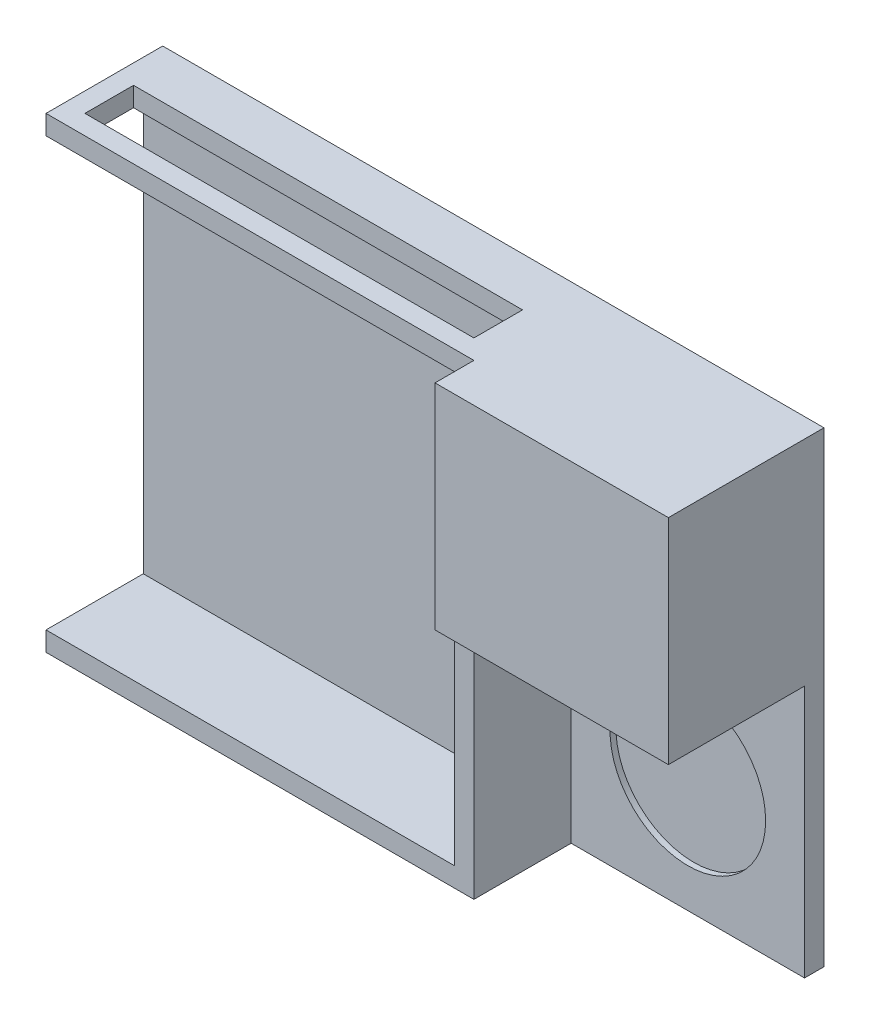
ISO-10303-21;
HEADER;
FILE_DESCRIPTION(('STEP AP214'),'2;1');
FILE_NAME('part.step','',(''),(''),'','','');
FILE_SCHEMA(('AUTOMOTIVE_DESIGN { 1 0 10303 214 1 1 1 1 }'));
ENDSEC;
DATA;
#1=APPLICATION_CONTEXT('core data for automotive mechanical design processes');
#2=APPLICATION_PROTOCOL_DEFINITION('international standard','automotive_design',2000,#1);
#3=PRODUCT_CONTEXT('',#1,'mechanical');
#4=PRODUCT('Part','Part','',(#3));
#5=PRODUCT_RELATED_PRODUCT_CATEGORY('part','',(#4));
#6=PRODUCT_DEFINITION_FORMATION('','',#4);
#7=PRODUCT_DEFINITION_CONTEXT('part definition',#1,'design');
#8=PRODUCT_DEFINITION('design','',#6,#7);
#9=PRODUCT_DEFINITION_SHAPE('','',#8);
#10=(LENGTH_UNIT() NAMED_UNIT(*) SI_UNIT(.MILLI.,.METRE.));
#11=(NAMED_UNIT(*) PLANE_ANGLE_UNIT() SI_UNIT($,.RADIAN.));
#12=(NAMED_UNIT(*) SI_UNIT($,.STERADIAN.) SOLID_ANGLE_UNIT());
#13=UNCERTAINTY_MEASURE_WITH_UNIT(LENGTH_MEASURE(1.E-05),#10,'distance_accuracy_value','');
#14=(GEOMETRIC_REPRESENTATION_CONTEXT(3) GLOBAL_UNCERTAINTY_ASSIGNED_CONTEXT((#13)) GLOBAL_UNIT_ASSIGNED_CONTEXT((#10,
#11,#12)) REPRESENTATION_CONTEXT('',''));
#15=CARTESIAN_POINT('',(0.,0.,0.));
#16=DIRECTION('',(0.,0.,1.));
#17=DIRECTION('',(1.,0.,0.));
#18=AXIS2_PLACEMENT_3D('',#15,#16,#17);
#19=CARTESIAN_POINT('',(-49.2177037871919,15.0239424703891,60.));
#20=DIRECTION('',(0.,-1.,0.));
#21=DIRECTION('',(1.,0.,0.));
#22=AXIS2_PLACEMENT_3D('',#19,#20,#21);
#23=PLANE('',#22);
#24=DIRECTION('',(0.,0.,1.));
#25=VECTOR('',#24,1.);
#26=CARTESIAN_POINT('',(-119.217703787192,15.0239424703891,60.));
#27=LINE('',#26,#25);
#28=CARTESIAN_POINT('',(-119.217703787192,15.0239424703891,52.5));
#29=VERTEX_POINT('',#28);
#30=CARTESIAN_POINT('',(-119.217703787192,15.0239424703891,57.5));
#31=VERTEX_POINT('',#30);
#32=EDGE_CURVE('E12',#29,#31,#27,.T.);
#33=ORIENTED_EDGE('',*,*,#32,.F.);
#34=DIRECTION('',(-1.,0.,0.));
#35=VECTOR('',#34,1.);
#36=CARTESIAN_POINT('',(-49.2177037871919,15.0239424703891,52.5));
#37=LINE('',#36,#35);
#38=CARTESIAN_POINT('',(-269.217703787192,15.0239424703891,52.5));
#39=VERTEX_POINT('',#38);
#40=EDGE_CURVE('E275',#29,#39,#37,.T.);
#41=ORIENTED_EDGE('',*,*,#40,.T.);
#42=DIRECTION('',(0.,0.,-1.));
#43=VECTOR('',#42,1.);
#44=CARTESIAN_POINT('',(-269.217703787192,15.0239424703891,60.));
#45=LINE('',#44,#43);
#46=CARTESIAN_POINT('',(-269.217703787192,15.0239424703891,10.));
#47=VERTEX_POINT('',#46);
#48=EDGE_CURVE('E350',#39,#47,#45,.T.);
#49=ORIENTED_EDGE('',*,*,#48,.T.);
#50=DIRECTION('',(-1.,0.,0.));
#51=VECTOR('',#50,1.);
#52=CARTESIAN_POINT('',(-49.2177037871919,15.0239424703891,10.));
#53=LINE('',#52,#51);
#54=CARTESIAN_POINT('',(-59.2177037871919,15.0239424703891,10.));
#55=VERTEX_POINT('',#54);
#56=EDGE_CURVE('E473',#55,#47,#53,.T.);
#57=ORIENTED_EDGE('',*,*,#56,.F.);
#58=DIRECTION('',(0.,0.,-1.));
#59=VECTOR('',#58,1.);
#60=CARTESIAN_POINT('',(-59.2177037871919,15.0239424703891,60.));
#61=LINE('',#60,#59);
#62=CARTESIAN_POINT('',(-59.2177037871918,15.0239424703891,25.));
#63=VERTEX_POINT('',#62);
#64=EDGE_CURVE('E349',#63,#55,#61,.T.);
#65=ORIENTED_EDGE('',*,*,#64,.F.);
#66=DIRECTION('',(-1.,0.,0.));
#67=VECTOR('',#66,1.);
#68=CARTESIAN_POINT('',(-49.2177037871919,15.0239424703891,25.));
#69=LINE('',#68,#67);
#70=CARTESIAN_POINT('',(-259.217703787192,15.0239424703891,25.));
#71=VERTEX_POINT('',#70);
#72=EDGE_CURVE('E298',#63,#71,#69,.T.);
#73=ORIENTED_EDGE('',*,*,#72,.T.);
#74=DIRECTION('',(0.,0.,-1.));
#75=VECTOR('',#74,1.);
#76=CARTESIAN_POINT('',(-259.217703787192,15.0239424703891,60.0000000000005));
#77=LINE('',#76,#75);
#78=CARTESIAN_POINT('',(-259.217703787192,15.0239424703891,50.));
#79=VERTEX_POINT('',#78);
#80=EDGE_CURVE('E359',#79,#71,#77,.T.);
#81=ORIENTED_EDGE('',*,*,#80,.F.);
#82=DIRECTION('',(-1.,0.,0.));
#83=VECTOR('',#82,1.);
#84=CARTESIAN_POINT('',(-49.2177037871919,15.0239424703891,50.));
#85=LINE('',#84,#83);
#86=CARTESIAN_POINT('',(-59.2177037871919,15.0239424703891,50.));
#87=VERTEX_POINT('',#86);
#88=EDGE_CURVE('E291',#87,#79,#85,.T.);
#89=ORIENTED_EDGE('',*,*,#88,.F.);
#90=CARTESIAN_POINT('',(-59.2177037871919,15.0239424703891,60.));
#91=VERTEX_POINT('',#90);
#92=EDGE_CURVE('E330',#91,#87,#61,.T.);
#93=ORIENTED_EDGE('',*,*,#92,.F.);
#94=DIRECTION('',(-1.,0.,0.));
#95=VECTOR('',#94,1.);
#96=CARTESIAN_POINT('',(-49.2177037871919,15.0239424703891,60.));
#97=LINE('',#96,#95);
#98=CARTESIAN_POINT('',(-269.217703787192,15.0239424703891,60.));
#99=VERTEX_POINT('',#98);
#100=EDGE_CURVE('E479',#91,#99,#97,.T.);
#101=ORIENTED_EDGE('',*,*,#100,.T.);
#102=CARTESIAN_POINT('',(-269.217703787192,15.0239424703891,57.5));
#103=VERTEX_POINT('',#102);
#104=EDGE_CURVE('E346',#99,#103,#45,.T.);
#105=ORIENTED_EDGE('',*,*,#104,.T.);
#106=DIRECTION('',(-1.,0.,0.));
#107=VECTOR('',#106,1.);
#108=CARTESIAN_POINT('',(-49.2177037871919,15.0239424703891,57.5));
#109=LINE('',#108,#107);
#110=EDGE_CURVE('E273',#31,#103,#109,.T.);
#111=ORIENTED_EDGE('',*,*,#110,.F.);
#112=EDGE_LOOP('',(#33,#41,#49,#57,#65,#73,#81,#89,#93,#101,#105,#111));
#113=FACE_BOUND('',#112,.T.);
#114=ADVANCED_FACE('F83',(#113),#23,.T.);
#115=CARTESIAN_POINT('',(-269.217703787192,0.,10.));
#116=DIRECTION('',(-1.,0.,0.));
#117=DIRECTION('',(0.,0.,1.));
#118=AXIS2_PLACEMENT_3D('',#115,#116,#117);
#119=PLANE('',#118);
#120=ORIENTED_EDGE('',*,*,#48,.F.);
#121=DIRECTION('',(0.,1.,0.));
#122=VECTOR('',#121,1.);
#123=CARTESIAN_POINT('',(-269.217703787192,0.,52.5));
#124=LINE('',#123,#122);
#125=CARTESIAN_POINT('',(-269.217703787192,16.2739424703891,52.5));
#126=VERTEX_POINT('',#125);
#127=EDGE_CURVE('E91',#39,#126,#124,.T.);
#128=ORIENTED_EDGE('',*,*,#127,.T.);
#129=DIRECTION('',(0.,0.,-1.));
#130=VECTOR('',#129,1.);
#131=CARTESIAN_POINT('',(-269.217703787192,16.2739424703891,57.5));
#132=LINE('',#131,#130);
#133=CARTESIAN_POINT('',(-269.217703787192,16.2739424703891,57.5));
#134=VERTEX_POINT('',#133);
#135=EDGE_CURVE('E259',#134,#126,#132,.T.);
#136=ORIENTED_EDGE('',*,*,#135,.F.);
#137=DIRECTION('',(0.,1.,0.));
#138=VECTOR('',#137,1.);
#139=CARTESIAN_POINT('',(-269.217703787192,0.,57.5));
#140=LINE('',#139,#138);
#141=EDGE_CURVE('E360',#103,#134,#140,.T.);
#142=ORIENTED_EDGE('',*,*,#141,.F.);
#143=ORIENTED_EDGE('',*,*,#104,.F.);
#144=DIRECTION('',(0.,-1.,0.));
#145=VECTOR('',#144,1.);
#146=CARTESIAN_POINT('',(-269.217703787192,25.0239424703891,60.));
#147=LINE('',#146,#145);
#148=CARTESIAN_POINT('',(-269.217703787192,25.0239424703891,60.));
#149=VERTEX_POINT('',#148);
#150=EDGE_CURVE('E481',#149,#99,#147,.T.);
#151=ORIENTED_EDGE('',*,*,#150,.F.);
#152=DIRECTION('',(0.,0.,-1.));
#153=VECTOR('',#152,1.);
#154=CARTESIAN_POINT('',(-269.217703787192,25.0239424703891,10.));
#155=LINE('',#154,#153);
#156=CARTESIAN_POINT('',(-269.217703787192,25.0239424703891,0.));
#157=VERTEX_POINT('',#156);
#158=EDGE_CURVE('E457',#149,#157,#155,.T.);
#159=ORIENTED_EDGE('',*,*,#158,.T.);
#160=DIRECTION('',(0.,1.,0.));
#161=VECTOR('',#160,1.);
#162=CARTESIAN_POINT('',(-269.217703787192,0.,0.));
#163=LINE('',#162,#161);
#164=CARTESIAN_POINT('',(-269.217703787192,-214.976057529611,0.));
#165=VERTEX_POINT('',#164);
#166=EDGE_CURVE('E438',#165,#157,#163,.T.);
#167=ORIENTED_EDGE('',*,*,#166,.F.);
#168=DIRECTION('',(0.,0.,-1.));
#169=VECTOR('',#168,1.);
#170=CARTESIAN_POINT('',(-269.217703787192,-214.976057529611,10.));
#171=LINE('',#170,#169);
#172=CARTESIAN_POINT('',(-269.217703787192,-214.976057529611,60.));
#173=VERTEX_POINT('',#172);
#174=EDGE_CURVE('E435',#173,#165,#171,.T.);
#175=ORIENTED_EDGE('',*,*,#174,.F.);
#176=DIRECTION('',(0.,1.,0.));
#177=VECTOR('',#176,1.);
#178=CARTESIAN_POINT('',(-269.217703787192,-214.976057529611,60.));
#179=LINE('',#178,#177);
#180=CARTESIAN_POINT('',(-269.217703787192,-204.976057529611,60.));
#181=VERTEX_POINT('',#180);
#182=EDGE_CURVE('E313',#173,#181,#179,.T.);
#183=ORIENTED_EDGE('',*,*,#182,.T.);
#184=DIRECTION('',(0.,0.,-1.));
#185=VECTOR('',#184,1.);
#186=CARTESIAN_POINT('',(-269.217703787192,-204.976057529611,60.));
#187=LINE('',#186,#185);
#188=CARTESIAN_POINT('',(-269.217703787192,-204.976057529611,10.));
#189=VERTEX_POINT('',#188);
#190=EDGE_CURVE('E336',#181,#189,#187,.T.);
#191=ORIENTED_EDGE('',*,*,#190,.T.);
#192=DIRECTION('',(0.,-1.,0.));
#193=VECTOR('',#192,1.);
#194=CARTESIAN_POINT('',(-269.217703787192,0.,10.));
#195=LINE('',#194,#193);
#196=EDGE_CURVE('E460',#47,#189,#195,.T.);
#197=ORIENTED_EDGE('',*,*,#196,.F.);
#198=EDGE_LOOP('',(#120,#128,#136,#142,#143,#151,#159,#167,#175,#183,#191,#197));
#199=FACE_BOUND('',#198,.T.);
#200=ADVANCED_FACE('F365',(#199),#119,.T.);
#201=CARTESIAN_POINT('',(0.,0.,10.));
#202=DIRECTION('',(0.,0.,1.));
#203=DIRECTION('',(1.,0.,0.));
#204=AXIS2_PLACEMENT_3D('',#201,#202,#203);
#205=PLANE('',#204);
#206=DIRECTION('',(-1.,0.,0.));
#207=VECTOR('',#206,1.);
#208=CARTESIAN_POINT('',(-49.2177037871918,-204.976057529611,10.));
#209=LINE('',#208,#207);
#210=CARTESIAN_POINT('',(-59.2177037871918,-204.976057529611,10.));
#211=VERTEX_POINT('',#210);
#212=EDGE_CURVE('E329',#211,#189,#209,.T.);
#213=ORIENTED_EDGE('',*,*,#212,.F.);
#214=DIRECTION('',(0.,-1.,0.));
#215=VECTOR('',#214,1.);
#216=CARTESIAN_POINT('',(-59.2177037871919,15.0239424703891,10.));
#217=LINE('',#216,#215);
#218=EDGE_CURVE('E305',#55,#211,#217,.T.);
#219=ORIENTED_EDGE('',*,*,#218,.F.);
#220=ORIENTED_EDGE('',*,*,#56,.T.);
#221=ORIENTED_EDGE('',*,*,#196,.T.);
#222=EDGE_LOOP('',(#213,#219,#220,#221));
#223=FACE_BOUND('',#222,.T.);
#224=ADVANCED_FACE('F396',(#223),#205,.T.);
#225=CARTESIAN_POINT('',(-99.2177037871918,25.0239424703892,10.));
#226=DIRECTION('',(0.,-1.,0.));
#227=DIRECTION('',(1.,0.,0.));
#228=AXIS2_PLACEMENT_3D('',#225,#226,#227);
#229=PLANE('',#228);
#230=DIRECTION('',(1.,0.,0.));
#231=VECTOR('',#230,1.);
#232=CARTESIAN_POINT('',(-49.2177037871919,25.0239424703892,80.));
#233=LINE('',#232,#231);
#234=CARTESIAN_POINT('',(-49.2177037871919,25.0239424703892,80.));
#235=VERTEX_POINT('',#234);
#236=CARTESIAN_POINT('',(70.7822962128082,25.0239424703892,80.));
#237=VERTEX_POINT('',#236);
#238=EDGE_CURVE('E232',#235,#237,#233,.T.);
#239=ORIENTED_EDGE('',*,*,#238,.T.);
#240=DIRECTION('',(0.,0.,-1.));
#241=VECTOR('',#240,1.);
#242=CARTESIAN_POINT('',(70.7822962128082,25.0239424703892,10.));
#243=LINE('',#242,#241);
#244=CARTESIAN_POINT('',(70.7822962128082,25.0239424703892,0.));
#245=VERTEX_POINT('',#244);
#246=EDGE_CURVE('E445',#237,#245,#243,.T.);
#247=ORIENTED_EDGE('',*,*,#246,.T.);
#248=DIRECTION('',(-1.,0.,0.));
#249=VECTOR('',#248,1.);
#250=CARTESIAN_POINT('',(-99.2177037871918,25.0239424703892,0.));
#251=LINE('',#250,#249);
#252=EDGE_CURVE('E448',#245,#157,#251,.T.);
#253=ORIENTED_EDGE('',*,*,#252,.T.);
#254=ORIENTED_EDGE('',*,*,#158,.F.);
#255=DIRECTION('',(-1.,0.,0.));
#256=VECTOR('',#255,1.);
#257=CARTESIAN_POINT('',(-49.2177037871919,25.0239424703891,60.));
#258=LINE('',#257,#256);
#259=CARTESIAN_POINT('',(-49.2177037871919,25.0239424703891,60.));
#260=VERTEX_POINT('',#259);
#261=EDGE_CURVE('E358',#260,#149,#258,.T.);
#262=ORIENTED_EDGE('',*,*,#261,.F.);
#263=DIRECTION('',(0.,0.,-1.));
#264=VECTOR('',#263,1.);
#265=CARTESIAN_POINT('',(-49.2177037871919,25.0239424703892,80.));
#266=LINE('',#265,#264);
#267=EDGE_CURVE('E243',#235,#260,#266,.T.);
#268=ORIENTED_EDGE('',*,*,#267,.F.);
#269=EDGE_LOOP('',(#239,#247,#253,#254,#262,#268));
#270=FACE_BOUND('',#269,.T.);
#271=DIRECTION('',(1.,0.,0.));
#272=VECTOR('',#271,1.);
#273=CARTESIAN_POINT('',(-259.217703787192,25.0239424703891,50.));
#274=LINE('',#273,#272);
#275=CARTESIAN_POINT('',(-259.217703787192,25.0239424703891,50.));
#276=VERTEX_POINT('',#275);
#277=CARTESIAN_POINT('',(-59.2177037871918,25.0239424703892,50.));
#278=VERTEX_POINT('',#277);
#279=EDGE_CURVE('E279',#276,#278,#274,.T.);
#280=ORIENTED_EDGE('',*,*,#279,.F.);
#281=DIRECTION('',(0.,0.,1.));
#282=VECTOR('',#281,1.);
#283=CARTESIAN_POINT('',(-259.217703787192,25.0239424703891,25.));
#284=LINE('',#283,#282);
#285=CARTESIAN_POINT('',(-259.217703787192,25.0239424703891,25.));
#286=VERTEX_POINT('',#285);
#287=EDGE_CURVE('E106',#286,#276,#284,.T.);
#288=ORIENTED_EDGE('',*,*,#287,.F.);
#289=DIRECTION('',(1.,0.,0.));
#290=VECTOR('',#289,1.);
#291=CARTESIAN_POINT('',(-259.217703787192,25.0239424703891,25.));
#292=LINE('',#291,#290);
#293=CARTESIAN_POINT('',(-59.2177037871918,25.0239424703892,25.));
#294=VERTEX_POINT('',#293);
#295=EDGE_CURVE('E285',#286,#294,#292,.T.);
#296=ORIENTED_EDGE('',*,*,#295,.T.);
#297=DIRECTION('',(0.,0.,1.));
#298=VECTOR('',#297,1.);
#299=CARTESIAN_POINT('',(-59.2177037871918,25.0239424703892,25.));
#300=LINE('',#299,#298);
#301=EDGE_CURVE('E282',#294,#278,#300,.T.);
#302=ORIENTED_EDGE('',*,*,#301,.T.);
#303=EDGE_LOOP('',(#280,#288,#296,#302));
#304=FACE_BOUND('',#303,.T.);
#305=ADVANCED_FACE('F417',(#270,#304),#229,.F.);
#306=CARTESIAN_POINT('',(-99.2177037871918,-214.976057529611,10.));
#307=DIRECTION('',(0.,-1.,0.));
#308=DIRECTION('',(1.,0.,0.));
#309=AXIS2_PLACEMENT_3D('',#306,#307,#308);
#310=PLANE('',#309);
#311=DIRECTION('',(-1.,0.,0.));
#312=VECTOR('',#311,1.);
#313=CARTESIAN_POINT('',(-99.2177037871918,-214.976057529611,0.));
#314=LINE('',#313,#312);
#315=CARTESIAN_POINT('',(70.7822962128082,-214.976057529611,0.));
#316=VERTEX_POINT('',#315);
#317=EDGE_CURVE('E431',#316,#165,#314,.T.);
#318=ORIENTED_EDGE('',*,*,#317,.F.);
#319=DIRECTION('',(0.,0.,-1.));
#320=VECTOR('',#319,1.);
#321=CARTESIAN_POINT('',(70.7822962128082,-214.976057529611,10.));
#322=LINE('',#321,#320);
#323=CARTESIAN_POINT('',(70.7822962128082,-214.976057529611,10.));
#324=VERTEX_POINT('',#323);
#325=EDGE_CURVE('E434',#324,#316,#322,.T.);
#326=ORIENTED_EDGE('',*,*,#325,.F.);
#327=DIRECTION('',(1.,0.,0.));
#328=VECTOR('',#327,1.);
#329=CARTESIAN_POINT('',(-99.2177037871918,-214.976057529611,10.));
#330=LINE('',#329,#328);
#331=CARTESIAN_POINT('',(-49.2177037871919,-214.976057529611,10.));
#332=VERTEX_POINT('',#331);
#333=EDGE_CURVE('E331',#332,#324,#330,.T.);
#334=ORIENTED_EDGE('',*,*,#333,.F.);
#335=DIRECTION('',(0.,0.,-1.));
#336=VECTOR('',#335,1.);
#337=CARTESIAN_POINT('',(-49.2177037871918,-214.976057529611,60.));
#338=LINE('',#337,#336);
#339=CARTESIAN_POINT('',(-49.2177037871918,-214.976057529611,60.));
#340=VERTEX_POINT('',#339);
#341=EDGE_CURVE('E319',#340,#332,#338,.T.);
#342=ORIENTED_EDGE('',*,*,#341,.F.);
#343=DIRECTION('',(-1.,0.,0.));
#344=VECTOR('',#343,1.);
#345=CARTESIAN_POINT('',(-49.2177037871918,-214.976057529611,60.));
#346=LINE('',#345,#344);
#347=EDGE_CURVE('E316',#340,#173,#346,.T.);
#348=ORIENTED_EDGE('',*,*,#347,.T.);
#349=ORIENTED_EDGE('',*,*,#174,.T.);
#350=EDGE_LOOP('',(#318,#326,#334,#342,#348,#349));
#351=FACE_BOUND('',#350,.T.);
#352=ADVANCED_FACE('F418',(#351),#310,.T.);
#353=CARTESIAN_POINT('',(70.7822962128082,0.,10.));
#354=DIRECTION('',(1.,0.,0.));
#355=DIRECTION('',(0.,1.,0.));
#356=AXIS2_PLACEMENT_3D('',#353,#354,#355);
#357=PLANE('',#356);
#358=DIRECTION('',(0.,-1.,0.));
#359=VECTOR('',#358,1.);
#360=CARTESIAN_POINT('',(70.7822962128082,0.,0.));
#361=LINE('',#360,#359);
#362=EDGE_CURVE('E439',#245,#316,#361,.T.);
#363=ORIENTED_EDGE('',*,*,#362,.F.);
#364=ORIENTED_EDGE('',*,*,#246,.F.);
#365=DIRECTION('',(0.,1.,0.));
#366=VECTOR('',#365,1.);
#367=CARTESIAN_POINT('',(70.7822962128082,-84.9760575296108,80.));
#368=LINE('',#367,#366);
#369=CARTESIAN_POINT('',(70.7822962128082,-84.9760575296108,80.));
#370=VERTEX_POINT('',#369);
#371=EDGE_CURVE('E256',#370,#237,#368,.T.);
#372=ORIENTED_EDGE('',*,*,#371,.F.);
#373=DIRECTION('',(0.,0.,-1.));
#374=VECTOR('',#373,1.);
#375=CARTESIAN_POINT('',(70.7822962128082,-84.9760575296108,80.));
#376=LINE('',#375,#374);
#377=CARTESIAN_POINT('',(70.7822962128082,-84.9760575296108,10.));
#378=VERTEX_POINT('',#377);
#379=EDGE_CURVE('E248',#370,#378,#376,.T.);
#380=ORIENTED_EDGE('',*,*,#379,.T.);
#381=DIRECTION('',(0.,1.,0.));
#382=VECTOR('',#381,1.);
#383=CARTESIAN_POINT('',(70.7822962128082,0.,10.));
#384=LINE('',#383,#382);
#385=EDGE_CURVE('E444',#324,#378,#384,.T.);
#386=ORIENTED_EDGE('',*,*,#385,.F.);
#387=ORIENTED_EDGE('',*,*,#325,.T.);
#388=EDGE_LOOP('',(#363,#364,#372,#380,#386,#387));
#389=FACE_BOUND('',#388,.T.);
#390=ADVANCED_FACE('F85',(#389),#357,.T.);
#391=DIRECTION('',(-1.,0.,0.));
#392=VECTOR('',#391,1.);
#393=CARTESIAN_POINT('',(70.7822962128082,-84.9760575296108,10.));
#394=LINE('',#393,#392);
#395=CARTESIAN_POINT('',(-49.2177037871919,-84.9760575296108,10.));
#396=VERTEX_POINT('',#395);
#397=EDGE_CURVE('E250',#378,#396,#394,.T.);
#398=ORIENTED_EDGE('',*,*,#397,.T.);
#399=DIRECTION('',(0.,1.,0.));
#400=VECTOR('',#399,1.);
#401=CARTESIAN_POINT('',(-49.2177037871918,-214.976057529611,10.));
#402=LINE('',#401,#400);
#403=EDGE_CURVE('E325',#332,#396,#402,.T.);
#404=ORIENTED_EDGE('',*,*,#403,.F.);
#405=ORIENTED_EDGE('',*,*,#333,.T.);
#406=ORIENTED_EDGE('',*,*,#385,.T.);
#407=EDGE_LOOP('',(#398,#404,#405,#406));
#408=FACE_BOUND('',#407,.T.);
#409=CARTESIAN_POINT('',(10.7822962128082,-154.976057529611,10.));
#410=DIRECTION('',(0.,0.,1.));
#411=DIRECTION('',(1.,0.,0.));
#412=AXIS2_PLACEMENT_3D('',#409,#410,#411);
#413=CIRCLE('',#412,40.);
#414=CARTESIAN_POINT('',(50.7822962128082,-154.976057529611,10.));
#415=VERTEX_POINT('',#414);
#416=EDGE_CURVE('E301',#415,#415,#413,.T.);
#417=ORIENTED_EDGE('',*,*,#416,.F.);
#418=EDGE_LOOP('',(#417));
#419=FACE_BOUND('',#418,.T.);
#420=ADVANCED_FACE('F409',(#408,#419),#205,.T.);
#421=CARTESIAN_POINT('',(0.,0.,0.));
#422=DIRECTION('',(0.,0.,1.));
#423=DIRECTION('',(1.,0.,0.));
#424=AXIS2_PLACEMENT_3D('',#421,#422,#423);
#425=PLANE('',#424);
#426=ORIENTED_EDGE('',*,*,#252,.F.);
#427=ORIENTED_EDGE('',*,*,#362,.T.);
#428=ORIENTED_EDGE('',*,*,#317,.T.);
#429=ORIENTED_EDGE('',*,*,#166,.T.);
#430=EDGE_LOOP('',(#426,#427,#428,#429));
#431=FACE_BOUND('',#430,.T.);
#432=ADVANCED_FACE('F412',(#431),#425,.F.);
#433=CARTESIAN_POINT('',(-49.2177037871918,-214.976057529611,60.));
#434=DIRECTION('',(-1.,0.,0.));
#435=DIRECTION('',(0.,-1.,0.));
#436=AXIS2_PLACEMENT_3D('',#433,#434,#435);
#437=PLANE('',#436);
#438=ORIENTED_EDGE('',*,*,#403,.T.);
#439=DIRECTION('',(0.,0.,-1.));
#440=VECTOR('',#439,1.);
#441=CARTESIAN_POINT('',(-49.2177037871919,-84.9760575296108,80.));
#442=LINE('',#441,#440);
#443=CARTESIAN_POINT('',(-49.2177037871919,-84.9760575296108,60.));
#444=VERTEX_POINT('',#443);
#445=EDGE_CURVE('E244',#444,#396,#442,.T.);
#446=ORIENTED_EDGE('',*,*,#445,.F.);
#447=DIRECTION('',(0.,1.,0.));
#448=VECTOR('',#447,1.);
#449=CARTESIAN_POINT('',(-49.2177037871918,-214.976057529611,60.));
#450=LINE('',#449,#448);
#451=EDGE_CURVE('E308',#340,#444,#450,.T.);
#452=ORIENTED_EDGE('',*,*,#451,.F.);
#453=ORIENTED_EDGE('',*,*,#341,.T.);
#454=EDGE_LOOP('',(#438,#446,#452,#453));
#455=FACE_BOUND('',#454,.T.);
#456=ADVANCED_FACE('F400',(#455),#437,.F.);
#457=CARTESIAN_POINT('',(0.,0.,60.));
#458=DIRECTION('',(0.,0.,1.));
#459=DIRECTION('',(1.,0.,0.));
#460=AXIS2_PLACEMENT_3D('',#457,#458,#459);
#461=PLANE('',#460);
#462=ORIENTED_EDGE('',*,*,#451,.T.);
#463=EDGE_CURVE('E240',#444,#260,#450,.T.);
#464=ORIENTED_EDGE('',*,*,#463,.T.);
#465=ORIENTED_EDGE('',*,*,#261,.T.);
#466=ORIENTED_EDGE('',*,*,#150,.T.);
#467=ORIENTED_EDGE('',*,*,#100,.F.);
#468=DIRECTION('',(0.,-1.,0.));
#469=VECTOR('',#468,1.);
#470=CARTESIAN_POINT('',(-59.2177037871919,15.0239424703891,60.));
#471=LINE('',#470,#469);
#472=CARTESIAN_POINT('',(-59.2177037871918,-204.976057529611,60.));
#473=VERTEX_POINT('',#472);
#474=EDGE_CURVE('E469',#91,#473,#471,.T.);
#475=ORIENTED_EDGE('',*,*,#474,.T.);
#476=DIRECTION('',(-1.,0.,0.));
#477=VECTOR('',#476,1.);
#478=CARTESIAN_POINT('',(-49.2177037871918,-204.976057529611,60.));
#479=LINE('',#478,#477);
#480=EDGE_CURVE('E311',#473,#181,#479,.T.);
#481=ORIENTED_EDGE('',*,*,#480,.T.);
#482=ORIENTED_EDGE('',*,*,#182,.F.);
#483=ORIENTED_EDGE('',*,*,#347,.F.);
#484=EDGE_LOOP('',(#462,#464,#465,#466,#467,#475,#481,#482,#483));
#485=FACE_BOUND('',#484,.T.);
#486=ADVANCED_FACE('F408',(#485),#461,.T.);
#487=CARTESIAN_POINT('',(-49.2177037871918,-204.976057529611,60.));
#488=DIRECTION('',(0.,-1.,0.));
#489=DIRECTION('',(1.,0.,0.));
#490=AXIS2_PLACEMENT_3D('',#487,#488,#489);
#491=PLANE('',#490);
#492=DIRECTION('',(0.,0.,1.));
#493=VECTOR('',#492,1.);
#494=CARTESIAN_POINT('',(-59.2177037871918,-204.976057529611,60.));
#495=LINE('',#494,#493);
#496=EDGE_CURVE('E343',#211,#473,#495,.T.);
#497=ORIENTED_EDGE('',*,*,#496,.F.);
#498=ORIENTED_EDGE('',*,*,#212,.T.);
#499=ORIENTED_EDGE('',*,*,#190,.F.);
#500=ORIENTED_EDGE('',*,*,#480,.F.);
#501=EDGE_LOOP('',(#497,#498,#499,#500));
#502=FACE_BOUND('',#501,.T.);
#503=ADVANCED_FACE('F406',(#502),#491,.F.);
#504=CARTESIAN_POINT('',(-59.2177037871919,15.0239424703891,60.));
#505=DIRECTION('',(1.,0.,0.));
#506=DIRECTION('',(0.,1.,0.));
#507=AXIS2_PLACEMENT_3D('',#504,#505,#506);
#508=PLANE('',#507);
#509=ORIENTED_EDGE('',*,*,#92,.T.);
#510=DIRECTION('',(0.,1.,0.));
#511=VECTOR('',#510,1.);
#512=CARTESIAN_POINT('',(-59.2177037871918,-74.9760575296108,50.));
#513=LINE('',#512,#511);
#514=EDGE_CURVE('E294',#87,#278,#513,.T.);
#515=ORIENTED_EDGE('',*,*,#514,.T.);
#516=ORIENTED_EDGE('',*,*,#301,.F.);
#517=DIRECTION('',(0.,1.,0.));
#518=VECTOR('',#517,1.);
#519=CARTESIAN_POINT('',(-59.2177037871918,-74.9760575296108,25.));
#520=LINE('',#519,#518);
#521=EDGE_CURVE('E292',#63,#294,#520,.T.);
#522=ORIENTED_EDGE('',*,*,#521,.F.);
#523=ORIENTED_EDGE('',*,*,#64,.T.);
#524=ORIENTED_EDGE('',*,*,#218,.T.);
#525=ORIENTED_EDGE('',*,*,#496,.T.);
#526=ORIENTED_EDGE('',*,*,#474,.F.);
#527=EDGE_LOOP('',(#509,#515,#516,#522,#523,#524,#525,#526));
#528=FACE_BOUND('',#527,.T.);
#529=ADVANCED_FACE('F402',(#528),#508,.F.);
#530=CARTESIAN_POINT('',(10.7822962128082,-154.976057529611,7.));
#531=DIRECTION('',(0.,0.,1.));
#532=DIRECTION('',(1.,0.,0.));
#533=AXIS2_PLACEMENT_3D('',#530,#531,#532);
#534=CYLINDRICAL_SURFACE('',#533,40.);
#535=CARTESIAN_POINT('',(10.7822962128082,-154.976057529611,7.));
#536=DIRECTION('',(0.,0.,1.));
#537=DIRECTION('',(1.,0.,0.));
#538=AXIS2_PLACEMENT_3D('',#535,#536,#537);
#539=CIRCLE('',#538,40.);
#540=CARTESIAN_POINT('',(50.7822962128082,-154.976057529611,7.));
#541=VERTEX_POINT('',#540);
#542=EDGE_CURVE('E302',#541,#541,#539,.T.);
#543=ORIENTED_EDGE('',*,*,#542,.F.);
#544=EDGE_LOOP('',(#543));
#545=FACE_BOUND('',#544,.T.);
#546=ORIENTED_EDGE('',*,*,#416,.T.);
#547=EDGE_LOOP('',(#546));
#548=FACE_BOUND('',#547,.T.);
#549=ADVANCED_FACE('F405',(#545,#548),#534,.F.);
#550=CARTESIAN_POINT('',(10.7822962128082,-154.976057529611,7.));
#551=DIRECTION('',(0.,0.,1.));
#552=DIRECTION('',(1.,0.,0.));
#553=AXIS2_PLACEMENT_3D('',#550,#551,#552);
#554=PLANE('',#553);
#555=ORIENTED_EDGE('',*,*,#542,.T.);
#556=EDGE_LOOP('',(#555));
#557=FACE_BOUND('',#556,.T.);
#558=ADVANCED_FACE('F508',(#557),#554,.T.);
#559=CARTESIAN_POINT('',(-259.217703787192,-74.9760575296109,25.));
#560=DIRECTION('',(-1.,0.,0.));
#561=DIRECTION('',(0.,0.,1.));
#562=AXIS2_PLACEMENT_3D('',#559,#560,#561);
#563=PLANE('',#562);
#564=ORIENTED_EDGE('',*,*,#80,.T.);
#565=DIRECTION('',(0.,1.,0.));
#566=VECTOR('',#565,1.);
#567=CARTESIAN_POINT('',(-259.217703787192,-74.9760575296109,25.));
#568=LINE('',#567,#566);
#569=EDGE_CURVE('E289',#71,#286,#568,.T.);
#570=ORIENTED_EDGE('',*,*,#569,.T.);
#571=ORIENTED_EDGE('',*,*,#287,.T.);
#572=DIRECTION('',(0.,1.,0.));
#573=VECTOR('',#572,1.);
#574=CARTESIAN_POINT('',(-259.217703787192,-74.9760575296109,50.));
#575=LINE('',#574,#573);
#576=EDGE_CURVE('E288',#79,#276,#575,.T.);
#577=ORIENTED_EDGE('',*,*,#576,.F.);
#578=EDGE_LOOP('',(#564,#570,#571,#577));
#579=FACE_BOUND('',#578,.T.);
#580=ADVANCED_FACE('F514',(#579),#563,.F.);
#581=CARTESIAN_POINT('',(-259.217703787192,-74.9760575296109,25.));
#582=DIRECTION('',(0.,0.,1.));
#583=DIRECTION('',(1.,0.,0.));
#584=AXIS2_PLACEMENT_3D('',#581,#582,#583);
#585=PLANE('',#584);
#586=ORIENTED_EDGE('',*,*,#521,.T.);
#587=ORIENTED_EDGE('',*,*,#295,.F.);
#588=ORIENTED_EDGE('',*,*,#569,.F.);
#589=ORIENTED_EDGE('',*,*,#72,.F.);
#590=EDGE_LOOP('',(#586,#587,#588,#589));
#591=FACE_BOUND('',#590,.T.);
#592=ADVANCED_FACE('F591',(#591),#585,.T.);
#593=CARTESIAN_POINT('',(-259.217703787192,-74.9760575296109,50.));
#594=DIRECTION('',(0.,0.,1.));
#595=DIRECTION('',(1.,0.,0.));
#596=AXIS2_PLACEMENT_3D('',#593,#594,#595);
#597=PLANE('',#596);
#598=ORIENTED_EDGE('',*,*,#88,.T.);
#599=ORIENTED_EDGE('',*,*,#576,.T.);
#600=ORIENTED_EDGE('',*,*,#279,.T.);
#601=ORIENTED_EDGE('',*,*,#514,.F.);
#602=EDGE_LOOP('',(#598,#599,#600,#601));
#603=FACE_BOUND('',#602,.T.);
#604=ADVANCED_FACE('F571',(#603),#597,.F.);
#605=CARTESIAN_POINT('',(-269.217703787192,-146.226057529611,52.5));
#606=DIRECTION('',(0.,0.,1.));
#607=DIRECTION('',(1.,0.,0.));
#608=AXIS2_PLACEMENT_3D('',#605,#606,#607);
#609=PLANE('',#608);
#610=DIRECTION('',(0.,1.,0.));
#611=VECTOR('',#610,1.);
#612=CARTESIAN_POINT('',(-119.217703787192,-146.226057529611,52.5));
#613=LINE('',#612,#611);
#614=CARTESIAN_POINT('',(-119.217703787192,16.2739424703891,52.5));
#615=VERTEX_POINT('',#614);
#616=EDGE_CURVE('E271',#29,#615,#613,.T.);
#617=ORIENTED_EDGE('',*,*,#616,.T.);
#618=DIRECTION('',(1.,0.,0.));
#619=VECTOR('',#618,1.);
#620=CARTESIAN_POINT('',(-269.217703787192,16.2739424703891,52.5));
#621=LINE('',#620,#619);
#622=EDGE_CURVE('E262',#126,#615,#621,.T.);
#623=ORIENTED_EDGE('',*,*,#622,.F.);
#624=ORIENTED_EDGE('',*,*,#127,.F.);
#625=ORIENTED_EDGE('',*,*,#40,.F.);
#626=EDGE_LOOP('',(#617,#623,#624,#625));
#627=FACE_BOUND('',#626,.T.);
#628=ADVANCED_FACE('F369',(#627),#609,.T.);
#629=CARTESIAN_POINT('',(-119.217703787192,-146.226057529611,57.5));
#630=DIRECTION('',(1.,0.,0.));
#631=DIRECTION('',(0.,1.,0.));
#632=AXIS2_PLACEMENT_3D('',#629,#630,#631);
#633=PLANE('',#632);
#634=ORIENTED_EDGE('',*,*,#32,.T.);
#635=DIRECTION('',(0.,1.,0.));
#636=VECTOR('',#635,1.);
#637=CARTESIAN_POINT('',(-119.217703787192,-146.226057529611,57.5));
#638=LINE('',#637,#636);
#639=CARTESIAN_POINT('',(-119.217703787192,16.2739424703891,57.5));
#640=VERTEX_POINT('',#639);
#641=EDGE_CURVE('E269',#31,#640,#638,.T.);
#642=ORIENTED_EDGE('',*,*,#641,.T.);
#643=DIRECTION('',(0.,0.,-1.));
#644=VECTOR('',#643,1.);
#645=CARTESIAN_POINT('',(-119.217703787192,16.2739424703891,57.5));
#646=LINE('',#645,#644);
#647=EDGE_CURVE('E265',#640,#615,#646,.T.);
#648=ORIENTED_EDGE('',*,*,#647,.T.);
#649=ORIENTED_EDGE('',*,*,#616,.F.);
#650=EDGE_LOOP('',(#634,#642,#648,#649));
#651=FACE_BOUND('',#650,.T.);
#652=ADVANCED_FACE('F378',(#651),#633,.F.);
#653=CARTESIAN_POINT('',(-269.217703787192,-146.226057529611,57.5));
#654=DIRECTION('',(0.,0.,1.));
#655=DIRECTION('',(1.,0.,0.));
#656=AXIS2_PLACEMENT_3D('',#653,#654,#655);
#657=PLANE('',#656);
#658=ORIENTED_EDGE('',*,*,#110,.T.);
#659=ORIENTED_EDGE('',*,*,#141,.T.);
#660=DIRECTION('',(1.,0.,0.));
#661=VECTOR('',#660,1.);
#662=CARTESIAN_POINT('',(-269.217703787192,16.2739424703891,57.5));
#663=LINE('',#662,#661);
#664=EDGE_CURVE('E98',#134,#640,#663,.T.);
#665=ORIENTED_EDGE('',*,*,#664,.T.);
#666=ORIENTED_EDGE('',*,*,#641,.F.);
#667=EDGE_LOOP('',(#658,#659,#665,#666));
#668=FACE_BOUND('',#667,.T.);
#669=ADVANCED_FACE('F380',(#668),#657,.F.);
#670=CARTESIAN_POINT('',(0.,16.2739424703892,0.));
#671=DIRECTION('',(0.,-1.,0.));
#672=DIRECTION('',(1.,0.,0.));
#673=AXIS2_PLACEMENT_3D('',#670,#671,#672);
#674=PLANE('',#673);
#675=ORIENTED_EDGE('',*,*,#135,.T.);
#676=ORIENTED_EDGE('',*,*,#622,.T.);
#677=ORIENTED_EDGE('',*,*,#647,.F.);
#678=ORIENTED_EDGE('',*,*,#664,.F.);
#679=EDGE_LOOP('',(#675,#676,#677,#678));
#680=FACE_BOUND('',#679,.T.);
#681=ADVANCED_FACE('F381',(#680),#674,.T.);
#682=CARTESIAN_POINT('',(70.7822962128082,-84.9760575296108,80.));
#683=DIRECTION('',(0.,-1.,0.));
#684=DIRECTION('',(1.,0.,0.));
#685=AXIS2_PLACEMENT_3D('',#682,#683,#684);
#686=PLANE('',#685);
#687=ORIENTED_EDGE('',*,*,#397,.F.);
#688=ORIENTED_EDGE('',*,*,#379,.F.);
#689=DIRECTION('',(-1.,0.,0.));
#690=VECTOR('',#689,1.);
#691=CARTESIAN_POINT('',(70.7822962128082,-84.9760575296108,80.));
#692=LINE('',#691,#690);
#693=CARTESIAN_POINT('',(-49.2177037871919,-84.9760575296108,80.));
#694=VERTEX_POINT('',#693);
#695=EDGE_CURVE('E230',#370,#694,#692,.T.);
#696=ORIENTED_EDGE('',*,*,#695,.T.);
#697=EDGE_CURVE('E237',#694,#444,#442,.T.);
#698=ORIENTED_EDGE('',*,*,#697,.T.);
#699=ORIENTED_EDGE('',*,*,#445,.T.);
#700=EDGE_LOOP('',(#687,#688,#696,#698,#699));
#701=FACE_BOUND('',#700,.T.);
#702=ADVANCED_FACE('F247',(#701),#686,.T.);
#703=CARTESIAN_POINT('',(-49.2177037871919,-74.9760575296108,80.));
#704=DIRECTION('',(-1.,0.,0.));
#705=DIRECTION('',(0.,0.,1.));
#706=AXIS2_PLACEMENT_3D('',#703,#704,#705);
#707=PLANE('',#706);
#708=ORIENTED_EDGE('',*,*,#267,.T.);
#709=ORIENTED_EDGE('',*,*,#463,.F.);
#710=ORIENTED_EDGE('',*,*,#697,.F.);
#711=DIRECTION('',(0.,-1.,0.));
#712=VECTOR('',#711,1.);
#713=CARTESIAN_POINT('',(-49.2177037871919,-74.9760575296108,80.));
#714=LINE('',#713,#712);
#715=EDGE_CURVE('E225',#235,#694,#714,.T.);
#716=ORIENTED_EDGE('',*,*,#715,.F.);
#717=EDGE_LOOP('',(#708,#709,#710,#716));
#718=FACE_BOUND('',#717,.T.);
#719=ADVANCED_FACE('F238',(#718),#707,.T.);
#720=CARTESIAN_POINT('',(0.,0.,80.));
#721=DIRECTION('',(0.,0.,1.));
#722=DIRECTION('',(1.,0.,0.));
#723=AXIS2_PLACEMENT_3D('',#720,#721,#722);
#724=PLANE('',#723);
#725=ORIENTED_EDGE('',*,*,#695,.F.);
#726=ORIENTED_EDGE('',*,*,#371,.T.);
#727=ORIENTED_EDGE('',*,*,#238,.F.);
#728=ORIENTED_EDGE('',*,*,#715,.T.);
#729=EDGE_LOOP('',(#725,#726,#727,#728));
#730=FACE_BOUND('',#729,.T.);
#731=ADVANCED_FACE('F227',(#730),#724,.T.);
#732=CLOSED_SHELL('',(#114,#200,#224,#305,#352,#390,#420,#432,#456,#486,#503,#529,#549,#558,
#580,#592,#604,#628,#652,#669,#681,#702,#719,#731));
#733=MANIFOLD_SOLID_BREP('B2',#732);
#734=ADVANCED_BREP_SHAPE_REPRESENTATION('',(#18,#733),#14);
#735=SHAPE_DEFINITION_REPRESENTATION(#9,#734);
ENDSEC;
END-ISO-10303-21;
